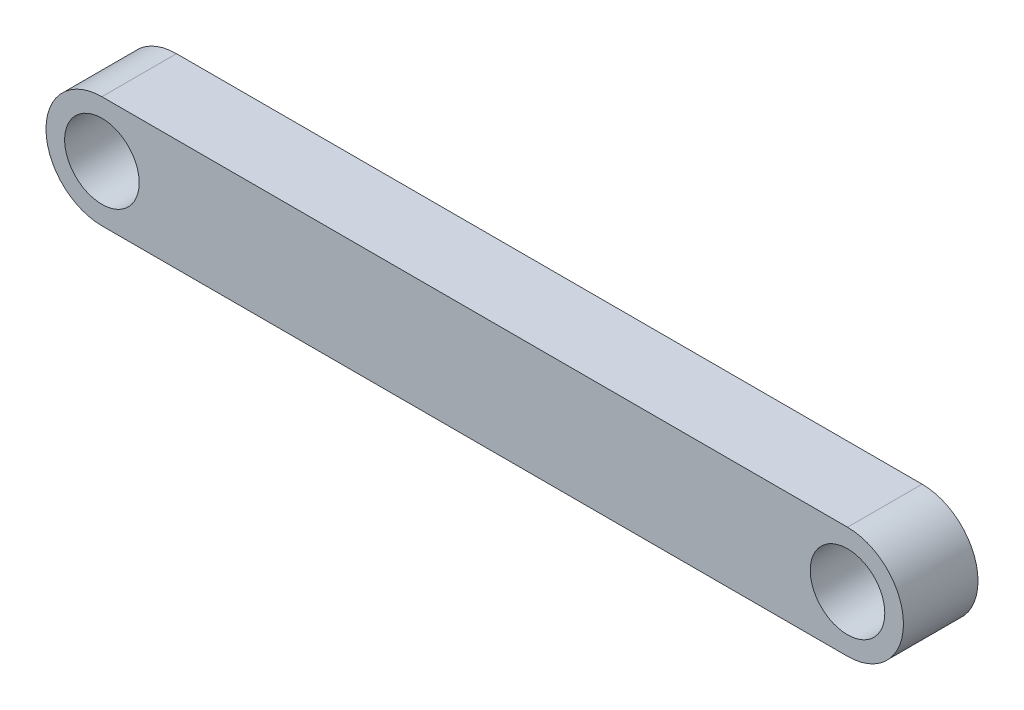
ISO-10303-21;
HEADER;
FILE_DESCRIPTION(('STEP AP214'),'2;1');
FILE_NAME('part.step','',(''),(''),'','','');
FILE_SCHEMA(('AUTOMOTIVE_DESIGN { 1 0 10303 214 1 1 1 1 }'));
ENDSEC;
DATA;
#1=APPLICATION_CONTEXT('core data for automotive mechanical design processes');
#2=APPLICATION_PROTOCOL_DEFINITION('international standard','automotive_design',2000,#1);
#3=PRODUCT_CONTEXT('',#1,'mechanical');
#4=PRODUCT('Part','Part','',(#3));
#5=PRODUCT_RELATED_PRODUCT_CATEGORY('part','',(#4));
#6=PRODUCT_DEFINITION_FORMATION('','',#4);
#7=PRODUCT_DEFINITION_CONTEXT('part definition',#1,'design');
#8=PRODUCT_DEFINITION('design','',#6,#7);
#9=PRODUCT_DEFINITION_SHAPE('','',#8);
#10=(LENGTH_UNIT() NAMED_UNIT(*) SI_UNIT(.MILLI.,.METRE.));
#11=(NAMED_UNIT(*) PLANE_ANGLE_UNIT() SI_UNIT($,.RADIAN.));
#12=(NAMED_UNIT(*) SI_UNIT($,.STERADIAN.) SOLID_ANGLE_UNIT());
#13=UNCERTAINTY_MEASURE_WITH_UNIT(LENGTH_MEASURE(1.E-05),#10,'distance_accuracy_value','');
#14=(GEOMETRIC_REPRESENTATION_CONTEXT(3) GLOBAL_UNCERTAINTY_ASSIGNED_CONTEXT((#13)) GLOBAL_UNIT_ASSIGNED_CONTEXT((#10,
#11,#12)) REPRESENTATION_CONTEXT('',''));
#15=CARTESIAN_POINT('',(0.,0.,0.));
#16=DIRECTION('',(0.,0.,1.));
#17=DIRECTION('',(1.,0.,0.));
#18=AXIS2_PLACEMENT_3D('',#15,#16,#17);
#19=CARTESIAN_POINT('',(0.,15.,20.));
#20=DIRECTION('',(0.,-1.,0.));
#21=DIRECTION('',(0.,0.,-1.));
#22=AXIS2_PLACEMENT_3D('',#19,#20,#21);
#23=PLANE('',#22);
#24=DIRECTION('',(-1.,0.,0.));
#25=VECTOR('',#24,1.);
#26=CARTESIAN_POINT('',(0.,15.,0.));
#27=LINE('',#26,#25);
#28=CARTESIAN_POINT('',(200.,15.,0.));
#29=VERTEX_POINT('',#28);
#30=CARTESIAN_POINT('',(0.,15.,0.));
#31=VERTEX_POINT('',#30);
#32=EDGE_CURVE('E111',#29,#31,#27,.T.);
#33=ORIENTED_EDGE('',*,*,#32,.T.);
#34=DIRECTION('',(0.,0.,-1.));
#35=VECTOR('',#34,1.);
#36=CARTESIAN_POINT('',(0.,15.,20.));
#37=LINE('',#36,#35);
#38=CARTESIAN_POINT('',(0.,15.,20.));
#39=VERTEX_POINT('',#38);
#40=EDGE_CURVE('E81',#39,#31,#37,.T.);
#41=ORIENTED_EDGE('',*,*,#40,.F.);
#42=DIRECTION('',(-1.,0.,0.));
#43=VECTOR('',#42,1.);
#44=CARTESIAN_POINT('',(0.,15.,20.));
#45=LINE('',#44,#43);
#46=CARTESIAN_POINT('',(200.,15.,20.));
#47=VERTEX_POINT('',#46);
#48=EDGE_CURVE('E104',#47,#39,#45,.T.);
#49=ORIENTED_EDGE('',*,*,#48,.F.);
#50=DIRECTION('',(0.,0.,-1.));
#51=VECTOR('',#50,1.);
#52=CARTESIAN_POINT('',(200.,15.,20.));
#53=LINE('',#52,#51);
#54=EDGE_CURVE('E11',#47,#29,#53,.T.);
#55=ORIENTED_EDGE('',*,*,#54,.T.);
#56=EDGE_LOOP('',(#33,#41,#49,#55));
#57=FACE_BOUND('',#56,.T.);
#58=ADVANCED_FACE('F17',(#57),#23,.F.);
#59=CARTESIAN_POINT('',(200.,0.,20.));
#60=DIRECTION('',(0.,0.,-1.));
#61=DIRECTION('',(-1.,0.,0.));
#62=AXIS2_PLACEMENT_3D('',#59,#60,#61);
#63=CYLINDRICAL_SURFACE('',#62,15.);
#64=CARTESIAN_POINT('',(200.,0.,0.));
#65=DIRECTION('',(0.,0.,1.));
#66=DIRECTION('',(1.,0.,0.));
#67=AXIS2_PLACEMENT_3D('',#64,#65,#66);
#68=CIRCLE('',#67,15.);
#69=CARTESIAN_POINT('',(200.,-15.,0.));
#70=VERTEX_POINT('',#69);
#71=EDGE_CURVE('E78',#70,#29,#68,.T.);
#72=ORIENTED_EDGE('',*,*,#71,.T.);
#73=ORIENTED_EDGE('',*,*,#54,.F.);
#74=CARTESIAN_POINT('',(200.,0.,20.));
#75=DIRECTION('',(0.,0.,1.));
#76=DIRECTION('',(1.,0.,0.));
#77=AXIS2_PLACEMENT_3D('',#74,#75,#76);
#78=CIRCLE('',#77,15.);
#79=CARTESIAN_POINT('',(200.,-15.,20.));
#80=VERTEX_POINT('',#79);
#81=EDGE_CURVE('E107',#80,#47,#78,.T.);
#82=ORIENTED_EDGE('',*,*,#81,.F.);
#83=DIRECTION('',(0.,0.,-1.));
#84=VECTOR('',#83,1.);
#85=CARTESIAN_POINT('',(200.,-15.,20.));
#86=LINE('',#85,#84);
#87=EDGE_CURVE('E26',#80,#70,#86,.T.);
#88=ORIENTED_EDGE('',*,*,#87,.T.);
#89=EDGE_LOOP('',(#72,#73,#82,#88));
#90=FACE_BOUND('',#89,.T.);
#91=ADVANCED_FACE('F145',(#90),#63,.T.);
#92=CARTESIAN_POINT('',(0.,-15.,20.));
#93=DIRECTION('',(0.,1.,0.));
#94=DIRECTION('',(1.,0.,0.));
#95=AXIS2_PLACEMENT_3D('',#92,#93,#94);
#96=PLANE('',#95);
#97=DIRECTION('',(1.,0.,0.));
#98=VECTOR('',#97,1.);
#99=CARTESIAN_POINT('',(0.,-15.,0.));
#100=LINE('',#99,#98);
#101=CARTESIAN_POINT('',(0.,-15.,0.));
#102=VERTEX_POINT('',#101);
#103=EDGE_CURVE('E72',#102,#70,#100,.T.);
#104=ORIENTED_EDGE('',*,*,#103,.T.);
#105=ORIENTED_EDGE('',*,*,#87,.F.);
#106=DIRECTION('',(1.,0.,0.));
#107=VECTOR('',#106,1.);
#108=CARTESIAN_POINT('',(0.,-15.,20.));
#109=LINE('',#108,#107);
#110=CARTESIAN_POINT('',(0.,-15.,20.));
#111=VERTEX_POINT('',#110);
#112=EDGE_CURVE('E87',#111,#80,#109,.T.);
#113=ORIENTED_EDGE('',*,*,#112,.F.);
#114=DIRECTION('',(0.,0.,-1.));
#115=VECTOR('',#114,1.);
#116=CARTESIAN_POINT('',(0.,-15.,20.));
#117=LINE('',#116,#115);
#118=EDGE_CURVE('E84',#111,#102,#117,.T.);
#119=ORIENTED_EDGE('',*,*,#118,.T.);
#120=EDGE_LOOP('',(#104,#105,#113,#119));
#121=FACE_BOUND('',#120,.T.);
#122=ADVANCED_FACE('F85',(#121),#96,.F.);
#123=CARTESIAN_POINT('',(0.,0.,0.));
#124=DIRECTION('',(0.,0.,1.));
#125=DIRECTION('',(1.,0.,0.));
#126=AXIS2_PLACEMENT_3D('',#123,#124,#125);
#127=PLANE('',#126);
#128=CARTESIAN_POINT('',(200.,0.,0.));
#129=DIRECTION('',(0.,0.,1.));
#130=DIRECTION('',(1.,0.,0.));
#131=AXIS2_PLACEMENT_3D('',#128,#129,#130);
#132=CIRCLE('',#131,10.);
#133=CARTESIAN_POINT('',(210.,0.,0.));
#134=VERTEX_POINT('',#133);
#135=EDGE_CURVE('E301',#134,#134,#132,.T.);
#136=ORIENTED_EDGE('',*,*,#135,.T.);
#137=EDGE_LOOP('',(#136));
#138=FACE_BOUND('',#137,.T.);
#139=CARTESIAN_POINT('',(0.,0.,0.));
#140=DIRECTION('',(0.,0.,1.));
#141=DIRECTION('',(1.,0.,0.));
#142=AXIS2_PLACEMENT_3D('',#139,#140,#141);
#143=CIRCLE('',#142,10.);
#144=CARTESIAN_POINT('',(10.,0.,0.));
#145=VERTEX_POINT('',#144);
#146=EDGE_CURVE('E101',#145,#145,#143,.T.);
#147=ORIENTED_EDGE('',*,*,#146,.T.);
#148=EDGE_LOOP('',(#147));
#149=FACE_BOUND('',#148,.T.);
#150=CARTESIAN_POINT('',(0.,0.,0.));
#151=DIRECTION('',(0.,0.,1.));
#152=DIRECTION('',(1.,0.,0.));
#153=AXIS2_PLACEMENT_3D('',#150,#151,#152);
#154=CIRCLE('',#153,15.);
#155=EDGE_CURVE('E76',#31,#102,#154,.T.);
#156=ORIENTED_EDGE('',*,*,#155,.F.);
#157=ORIENTED_EDGE('',*,*,#32,.F.);
#158=ORIENTED_EDGE('',*,*,#71,.F.);
#159=ORIENTED_EDGE('',*,*,#103,.F.);
#160=EDGE_LOOP('',(#156,#157,#158,#159));
#161=FACE_BOUND('',#160,.T.);
#162=ADVANCED_FACE('F19',(#138,#149,#161),#127,.F.);
#163=CARTESIAN_POINT('',(0.,0.,20.));
#164=DIRECTION('',(0.,0.,1.));
#165=DIRECTION('',(1.,0.,0.));
#166=AXIS2_PLACEMENT_3D('',#163,#164,#165);
#167=PLANE('',#166);
#168=CARTESIAN_POINT('',(200.,0.,20.));
#169=DIRECTION('',(0.,0.,1.));
#170=DIRECTION('',(1.,0.,0.));
#171=AXIS2_PLACEMENT_3D('',#168,#169,#170);
#172=CIRCLE('',#171,10.);
#173=CARTESIAN_POINT('',(210.,0.,20.));
#174=VERTEX_POINT('',#173);
#175=EDGE_CURVE('E316',#174,#174,#172,.T.);
#176=ORIENTED_EDGE('',*,*,#175,.F.);
#177=EDGE_LOOP('',(#176));
#178=FACE_BOUND('',#177,.T.);
#179=CARTESIAN_POINT('',(0.,0.,20.));
#180=DIRECTION('',(0.,0.,1.));
#181=DIRECTION('',(1.,0.,0.));
#182=AXIS2_PLACEMENT_3D('',#179,#180,#181);
#183=CIRCLE('',#182,10.);
#184=CARTESIAN_POINT('',(10.,0.,20.));
#185=VERTEX_POINT('',#184);
#186=EDGE_CURVE('E305',#185,#185,#183,.T.);
#187=ORIENTED_EDGE('',*,*,#186,.F.);
#188=EDGE_LOOP('',(#187));
#189=FACE_BOUND('',#188,.T.);
#190=ORIENTED_EDGE('',*,*,#48,.T.);
#191=CARTESIAN_POINT('',(0.,0.,20.));
#192=DIRECTION('',(0.,0.,1.));
#193=DIRECTION('',(1.,0.,0.));
#194=AXIS2_PLACEMENT_3D('',#191,#192,#193);
#195=CIRCLE('',#194,15.);
#196=EDGE_CURVE('E95',#39,#111,#195,.T.);
#197=ORIENTED_EDGE('',*,*,#196,.T.);
#198=ORIENTED_EDGE('',*,*,#112,.T.);
#199=ORIENTED_EDGE('',*,*,#81,.T.);
#200=EDGE_LOOP('',(#190,#197,#198,#199));
#201=FACE_BOUND('',#200,.T.);
#202=ADVANCED_FACE('F167',(#178,#189,#201),#167,.T.);
#203=CARTESIAN_POINT('',(0.,0.,20.));
#204=DIRECTION('',(0.,0.,-1.));
#205=DIRECTION('',(-1.,0.,0.));
#206=AXIS2_PLACEMENT_3D('',#203,#204,#205);
#207=CYLINDRICAL_SURFACE('',#206,15.);
#208=ORIENTED_EDGE('',*,*,#196,.F.);
#209=ORIENTED_EDGE('',*,*,#40,.T.);
#210=ORIENTED_EDGE('',*,*,#155,.T.);
#211=ORIENTED_EDGE('',*,*,#118,.F.);
#212=EDGE_LOOP('',(#208,#209,#210,#211));
#213=FACE_BOUND('',#212,.T.);
#214=ADVANCED_FACE('F92',(#213),#207,.T.);
#215=CARTESIAN_POINT('',(0.,0.,20.));
#216=DIRECTION('',(0.,0.,-1.));
#217=DIRECTION('',(-1.,0.,0.));
#218=AXIS2_PLACEMENT_3D('',#215,#216,#217);
#219=CYLINDRICAL_SURFACE('',#218,10.);
#220=ORIENTED_EDGE('',*,*,#146,.F.);
#221=EDGE_LOOP('',(#220));
#222=FACE_BOUND('',#221,.T.);
#223=ORIENTED_EDGE('',*,*,#186,.T.);
#224=EDGE_LOOP('',(#223));
#225=FACE_BOUND('',#224,.T.);
#226=ADVANCED_FACE('F133',(#222,#225),#219,.F.);
#227=CARTESIAN_POINT('',(200.,0.,20.));
#228=DIRECTION('',(0.,0.,-1.));
#229=DIRECTION('',(-1.,0.,0.));
#230=AXIS2_PLACEMENT_3D('',#227,#228,#229);
#231=CYLINDRICAL_SURFACE('',#230,10.);
#232=ORIENTED_EDGE('',*,*,#135,.F.);
#233=EDGE_LOOP('',(#232));
#234=FACE_BOUND('',#233,.T.);
#235=ORIENTED_EDGE('',*,*,#175,.T.);
#236=EDGE_LOOP('',(#235));
#237=FACE_BOUND('',#236,.T.);
#238=ADVANCED_FACE('F129',(#234,#237),#231,.F.);
#239=CLOSED_SHELL('',(#58,#91,#122,#162,#202,#214,#226,#238));
#240=MANIFOLD_SOLID_BREP('B1',#239);
#241=ADVANCED_BREP_SHAPE_REPRESENTATION('',(#18,#240),#14);
#242=SHAPE_DEFINITION_REPRESENTATION(#9,#241);
ENDSEC;
END-ISO-10303-21;
